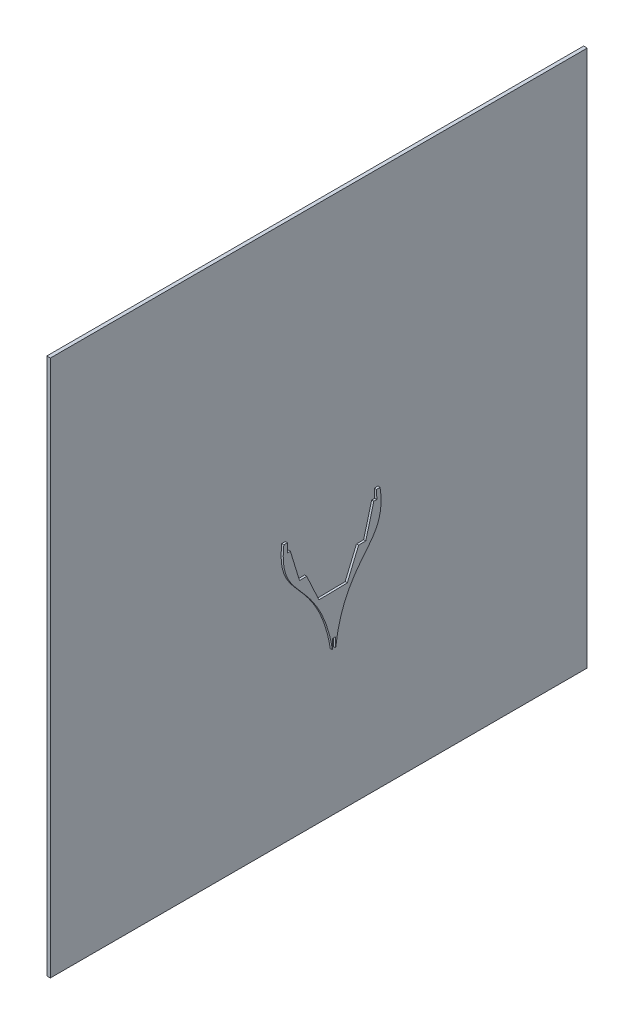
ISO-10303-21;
HEADER;
FILE_DESCRIPTION(('STEP AP214'),'2;1');
FILE_NAME('part.step','',(''),(''),'','','');
FILE_SCHEMA(('AUTOMOTIVE_DESIGN { 1 0 10303 214 1 1 1 1 }'));
ENDSEC;
DATA;
#1=APPLICATION_CONTEXT('core data for automotive mechanical design processes');
#2=APPLICATION_PROTOCOL_DEFINITION('international standard','automotive_design',2000,#1);
#3=PRODUCT_CONTEXT('',#1,'mechanical');
#4=PRODUCT('Part','Part','',(#3));
#5=PRODUCT_RELATED_PRODUCT_CATEGORY('part','',(#4));
#6=PRODUCT_DEFINITION_FORMATION('','',#4);
#7=PRODUCT_DEFINITION_CONTEXT('part definition',#1,'design');
#8=PRODUCT_DEFINITION('design','',#6,#7);
#9=PRODUCT_DEFINITION_SHAPE('','',#8);
#10=(LENGTH_UNIT() NAMED_UNIT(*) SI_UNIT(.MILLI.,.METRE.));
#11=(NAMED_UNIT(*) PLANE_ANGLE_UNIT() SI_UNIT($,.RADIAN.));
#12=(NAMED_UNIT(*) SI_UNIT($,.STERADIAN.) SOLID_ANGLE_UNIT());
#13=UNCERTAINTY_MEASURE_WITH_UNIT(LENGTH_MEASURE(1.E-05),#10,'distance_accuracy_value','');
#14=(GEOMETRIC_REPRESENTATION_CONTEXT(3) GLOBAL_UNCERTAINTY_ASSIGNED_CONTEXT((#13)) GLOBAL_UNIT_ASSIGNED_CONTEXT((#10,
#11,#12)) REPRESENTATION_CONTEXT('',''));
#15=CARTESIAN_POINT('',(0.,0.,0.));
#16=DIRECTION('',(0.,0.,1.));
#17=DIRECTION('',(1.,0.,0.));
#18=AXIS2_PLACEMENT_3D('',#15,#16,#17);
#19=CARTESIAN_POINT('',(6.,359.150420720607,141.004160791216));
#20=CARTESIAN_POINT('',(6.,184.373215516213,160.999534843018));
#21=CARTESIAN_POINT('',(6.,267.002875027698,12.1205447980956));
#22=CARTESIAN_POINT('',(6.,18.0649619587303,4.61229483232223));
#23=CARTESIAN_POINT('',(6.,0.,0.));
#24=B_SPLINE_CURVE_WITH_KNOTS('',4,(#19,#20,#21,#22,#23),.UNSPECIFIED.,.F.,.F.,(5,5),(0.,1.),.UNSPECIFIED.);
#25=DIRECTION('',(-1.,0.,0.));
#26=VECTOR('',#25,1.);
#27=SURFACE_OF_LINEAR_EXTRUSION('',#24,#26);
#28=CARTESIAN_POINT('',(0.,359.150420720607,141.004160791216));
#29=CARTESIAN_POINT('',(0.,184.373215516213,160.999534843018));
#30=CARTESIAN_POINT('',(0.,267.002875027698,12.1205447980956));
#31=CARTESIAN_POINT('',(0.,18.0649619587303,4.61229483232223));
#32=CARTESIAN_POINT('',(0.,0.,0.));
#33=B_SPLINE_CURVE_WITH_KNOTS('',4,(#28,#29,#30,#31,#32),.UNSPECIFIED.,.F.,.F.,(5,5),(0.,1.),.UNSPECIFIED.);
#34=CARTESIAN_POINT('',(0.,359.150420720607,141.004160791216));
#35=VERTEX_POINT('',#34);
#36=CARTESIAN_POINT('',(0.,37.3764689703785,5.17856558690667));
#37=VERTEX_POINT('',#36);
#38=EDGE_CURVE('E192',#35,#37,#33,.T.);
#39=ORIENTED_EDGE('',*,*,#38,.T.);
#40=DIRECTION('',(1.,0.,0.));
#41=VECTOR('',#40,1.);
#42=CARTESIAN_POINT('',(0.,37.3764689703785,5.17856558690667));
#43=LINE('',#42,#41);
#44=CARTESIAN_POINT('',(6.,37.3764689703785,5.17856558690667));
#45=VERTEX_POINT('',#44);
#46=EDGE_CURVE('E198',#37,#45,#43,.T.);
#47=ORIENTED_EDGE('',*,*,#46,.T.);
#48=CARTESIAN_POINT('',(6.,359.150420720607,141.004160791216));
#49=VERTEX_POINT('',#48);
#50=EDGE_CURVE('E232',#49,#45,#24,.T.);
#51=ORIENTED_EDGE('',*,*,#50,.F.);
#52=DIRECTION('',(-1.,0.,0.));
#53=VECTOR('',#52,1.);
#54=CARTESIAN_POINT('',(6.,359.150420720607,141.004160791216));
#55=LINE('',#54,#53);
#56=EDGE_CURVE('E188',#49,#35,#55,.T.);
#57=ORIENTED_EDGE('',*,*,#56,.T.);
#58=EDGE_LOOP('',(#39,#47,#51,#57));
#59=FACE_BOUND('',#58,.T.);
#60=ADVANCED_FACE('F45',(#59),#27,.F.);
#61=CARTESIAN_POINT('',(6.,0.,0.));
#62=CARTESIAN_POINT('',(6.,18.2201613043675,-3.95497613563854));
#63=CARTESIAN_POINT('',(6.,267.266681930229,-2.44205021752013));
#64=CARTESIAN_POINT('',(6.,190.083465853855,-154.216110794049));
#65=CARTESIAN_POINT('',(6.,364.021786678852,-127.903623433274));
#66=B_SPLINE_CURVE_WITH_KNOTS('',4,(#61,#62,#63,#64,#65),.UNSPECIFIED.,.F.,.F.,(5,5),(0.,1.),.UNSPECIFIED.);
#67=DIRECTION('',(-1.,0.,0.));
#68=VECTOR('',#67,1.);
#69=SURFACE_OF_LINEAR_EXTRUSION('',#66,#68);
#70=CARTESIAN_POINT('',(6.,37.5395073656805,-3.82143441309333));
#71=VERTEX_POINT('',#70);
#72=CARTESIAN_POINT('',(6.,364.021786678852,-127.903623433274));
#73=VERTEX_POINT('',#72);
#74=EDGE_CURVE('E128',#71,#73,#66,.T.);
#75=ORIENTED_EDGE('',*,*,#74,.F.);
#76=DIRECTION('',(1.,0.,0.));
#77=VECTOR('',#76,1.);
#78=CARTESIAN_POINT('',(0.,37.5395073656805,-3.82143441309333));
#79=LINE('',#78,#77);
#80=CARTESIAN_POINT('',(0.,37.5395073656805,-3.82143441309333));
#81=VERTEX_POINT('',#80);
#82=EDGE_CURVE('E322',#81,#71,#79,.T.);
#83=ORIENTED_EDGE('',*,*,#82,.F.);
#84=CARTESIAN_POINT('',(0.,0.,0.));
#85=CARTESIAN_POINT('',(0.,18.2201613043675,-3.95497613563854));
#86=CARTESIAN_POINT('',(0.,267.266681930229,-2.44205021752013));
#87=CARTESIAN_POINT('',(0.,190.083465853855,-154.216110794049));
#88=CARTESIAN_POINT('',(0.,364.021786678852,-127.903623433274));
#89=B_SPLINE_CURVE_WITH_KNOTS('',4,(#84,#85,#86,#87,#88),.UNSPECIFIED.,.F.,.F.,(5,5),(0.,1.),.UNSPECIFIED.);
#90=CARTESIAN_POINT('',(0.,364.021786678852,-127.903623433274));
#91=VERTEX_POINT('',#90);
#92=EDGE_CURVE('E197',#81,#91,#89,.T.);
#93=ORIENTED_EDGE('',*,*,#92,.T.);
#94=DIRECTION('',(-1.,0.,0.));
#95=VECTOR('',#94,1.);
#96=CARTESIAN_POINT('',(6.,364.021786678852,-127.903623433274));
#97=LINE('',#96,#95);
#98=EDGE_CURVE('E13',#73,#91,#97,.T.);
#99=ORIENTED_EDGE('',*,*,#98,.F.);
#100=EDGE_LOOP('',(#75,#83,#93,#99));
#101=FACE_BOUND('',#100,.T.);
#102=ADVANCED_FACE('F334',(#101),#69,.F.);
#103=CARTESIAN_POINT('',(6.,364.021786678852,-127.903623433274));
#104=DIRECTION('',(0.,-0.999835956927465,-0.0181124055536444));
#105=DIRECTION('',(0.,0.0181124055536444,-0.999835956927465));
#106=AXIS2_PLACEMENT_3D('',#103,#104,#105);
#107=PLANE('',#106);
#108=DIRECTION('',(0.,-0.0181124055536444,0.999835956927465));
#109=VECTOR('',#108,1.);
#110=CARTESIAN_POINT('',(0.,364.021786678852,-127.903623433274));
#111=LINE('',#110,#109);
#112=CARTESIAN_POINT('',(0.,363.840632906294,-117.903623433274));
#113=VERTEX_POINT('',#112);
#114=EDGE_CURVE('E205',#91,#113,#111,.T.);
#115=ORIENTED_EDGE('',*,*,#114,.T.);
#116=DIRECTION('',(-1.,0.,0.));
#117=VECTOR('',#116,1.);
#118=CARTESIAN_POINT('',(6.,363.840632906294,-117.903623433274));
#119=LINE('',#118,#117);
#120=CARTESIAN_POINT('',(6.,363.840632906294,-117.903623433274));
#121=VERTEX_POINT('',#120);
#122=EDGE_CURVE('E53',#121,#113,#119,.T.);
#123=ORIENTED_EDGE('',*,*,#122,.F.);
#124=DIRECTION('',(0.,-0.0181124055536444,0.999835956927465));
#125=VECTOR('',#124,1.);
#126=CARTESIAN_POINT('',(6.,364.021786678852,-127.903623433274));
#127=LINE('',#126,#125);
#128=EDGE_CURVE('E316',#73,#121,#127,.T.);
#129=ORIENTED_EDGE('',*,*,#128,.F.);
#130=ORIENTED_EDGE('',*,*,#98,.T.);
#131=EDGE_LOOP('',(#115,#123,#129,#130));
#132=FACE_BOUND('',#131,.T.);
#133=ADVANCED_FACE('F337',(#132),#107,.F.);
#134=CARTESIAN_POINT('',(6.,363.840632906294,-117.903623433274));
#135=DIRECTION('',(0.,0.0415686492906729,-0.999135650147741));
#136=DIRECTION('',(0.,0.999135650147741,0.0415686492906729));
#137=AXIS2_PLACEMENT_3D('',#134,#135,#136);
#138=PLANE('',#137);
#139=DIRECTION('',(0.,-0.999135650147741,-0.0415686492906729));
#140=VECTOR('',#139,1.);
#141=CARTESIAN_POINT('',(0.,363.840632906294,-117.903623433274));
#142=LINE('',#141,#140);
#143=CARTESIAN_POINT('',(0.,338.999069942575,-118.937146977868));
#144=VERTEX_POINT('',#143);
#145=EDGE_CURVE('E210',#113,#144,#142,.T.);
#146=ORIENTED_EDGE('',*,*,#145,.T.);
#147=DIRECTION('',(-1.,0.,0.));
#148=VECTOR('',#147,1.);
#149=CARTESIAN_POINT('',(6.,338.999069942575,-118.937146977868));
#150=LINE('',#149,#148);
#151=CARTESIAN_POINT('',(6.,338.999069942575,-118.937146977868));
#152=VERTEX_POINT('',#151);
#153=EDGE_CURVE('E257',#152,#144,#150,.T.);
#154=ORIENTED_EDGE('',*,*,#153,.F.);
#155=DIRECTION('',(0.,-0.999135650147741,-0.0415686492906729));
#156=VECTOR('',#155,1.);
#157=CARTESIAN_POINT('',(6.,363.840632906294,-117.903623433274));
#158=LINE('',#157,#156);
#159=EDGE_CURVE('E266',#121,#152,#158,.T.);
#160=ORIENTED_EDGE('',*,*,#159,.F.);
#161=ORIENTED_EDGE('',*,*,#122,.T.);
#162=EDGE_LOOP('',(#146,#154,#160,#161));
#163=FACE_BOUND('',#162,.T.);
#164=ADVANCED_FACE('F264',(#163),#138,.F.);
#165=CARTESIAN_POINT('',(6.,338.999069942575,-118.937146977868));
#166=DIRECTION('',(0.,-0.999835956927465,-0.0181124055536451));
#167=DIRECTION('',(0.,0.0181124055536451,-0.999835956927465));
#168=AXIS2_PLACEMENT_3D('',#165,#166,#167);
#169=PLANE('',#168);
#170=DIRECTION('',(0.,-0.0181124055536451,0.999835956927465));
#171=VECTOR('',#170,1.);
#172=CARTESIAN_POINT('',(0.,338.999069942575,-118.937146977868));
#173=LINE('',#172,#171);
#174=CARTESIAN_POINT('',(0.,338.84711977491,-110.549236225597));
#175=VERTEX_POINT('',#174);
#176=EDGE_CURVE('E212',#144,#175,#173,.T.);
#177=ORIENTED_EDGE('',*,*,#176,.T.);
#178=DIRECTION('',(-1.,0.,0.));
#179=VECTOR('',#178,1.);
#180=CARTESIAN_POINT('',(6.,338.84711977491,-110.549236225597));
#181=LINE('',#180,#179);
#182=CARTESIAN_POINT('',(6.,338.84711977491,-110.549236225597));
#183=VERTEX_POINT('',#182);
#184=EDGE_CURVE('E254',#183,#175,#181,.T.);
#185=ORIENTED_EDGE('',*,*,#184,.F.);
#186=DIRECTION('',(0.,-0.0181124055536451,0.999835956927465));
#187=VECTOR('',#186,1.);
#188=CARTESIAN_POINT('',(6.,338.999069942575,-118.937146977868));
#189=LINE('',#188,#187);
#190=EDGE_CURVE('E287',#152,#183,#189,.T.);
#191=ORIENTED_EDGE('',*,*,#190,.F.);
#192=ORIENTED_EDGE('',*,*,#153,.T.);
#193=EDGE_LOOP('',(#177,#185,#191,#192));
#194=FACE_BOUND('',#193,.T.);
#195=ADVANCED_FACE('F278',(#194),#169,.F.);
#196=CARTESIAN_POINT('',(6.,338.84711977491,-110.549236225597));
#197=DIRECTION('',(0.,-0.257490175426916,-0.966280916482684));
#198=DIRECTION('',(0.,0.966280916482684,-0.257490175426916));
#199=AXIS2_PLACEMENT_3D('',#196,#197,#198);
#200=PLANE('',#199);
#201=DIRECTION('',(0.,-0.966280916482684,0.257490175426916));
#202=VECTOR('',#201,1.);
#203=CARTESIAN_POINT('',(0.,338.84711977491,-110.549236225597));
#204=LINE('',#203,#202);
#205=CARTESIAN_POINT('',(0.,254.215348918144,-87.9969440785862));
#206=VERTEX_POINT('',#205);
#207=EDGE_CURVE('E214',#175,#206,#204,.T.);
#208=ORIENTED_EDGE('',*,*,#207,.T.);
#209=DIRECTION('',(-1.,0.,0.));
#210=VECTOR('',#209,1.);
#211=CARTESIAN_POINT('',(6.,254.215348918144,-87.9969440785862));
#212=LINE('',#211,#210);
#213=CARTESIAN_POINT('',(6.,254.215348918144,-87.9969440785862));
#214=VERTEX_POINT('',#213);
#215=EDGE_CURVE('E251',#214,#206,#212,.T.);
#216=ORIENTED_EDGE('',*,*,#215,.F.);
#217=DIRECTION('',(0.,-0.966280916482684,0.257490175426916));
#218=VECTOR('',#217,1.);
#219=CARTESIAN_POINT('',(6.,338.84711977491,-110.549236225597));
#220=LINE('',#219,#218);
#221=EDGE_CURVE('E284',#183,#214,#220,.T.);
#222=ORIENTED_EDGE('',*,*,#221,.F.);
#223=ORIENTED_EDGE('',*,*,#184,.T.);
#224=EDGE_LOOP('',(#208,#216,#222,#223));
#225=FACE_BOUND('',#224,.T.);
#226=ADVANCED_FACE('F282',(#225),#200,.F.);
#227=CARTESIAN_POINT('',(6.,254.215348918144,-87.9969440785862));
#228=DIRECTION('',(0.,-0.999835956927465,-0.0181124055536441));
#229=DIRECTION('',(0.,0.0181124055536441,-0.999835956927465));
#230=AXIS2_PLACEMENT_3D('',#227,#228,#229);
#231=PLANE('',#230);
#232=DIRECTION('',(0.,-0.0181124055536441,0.999835956927465));
#233=VECTOR('',#232,1.);
#234=CARTESIAN_POINT('',(0.,254.215348918144,-87.9969440785862));
#235=LINE('',#234,#233);
#236=CARTESIAN_POINT('',(0.,253.853344168558,-68.0136589129124));
#237=VERTEX_POINT('',#236);
#238=EDGE_CURVE('E216',#206,#237,#235,.T.);
#239=ORIENTED_EDGE('',*,*,#238,.T.);
#240=DIRECTION('',(-1.,0.,0.));
#241=VECTOR('',#240,1.);
#242=CARTESIAN_POINT('',(6.,253.853344168558,-68.0136589129124));
#243=LINE('',#242,#241);
#244=CARTESIAN_POINT('',(6.,253.853344168558,-68.0136589129124));
#245=VERTEX_POINT('',#244);
#246=EDGE_CURVE('E248',#245,#237,#243,.T.);
#247=ORIENTED_EDGE('',*,*,#246,.F.);
#248=DIRECTION('',(0.,-0.0181124055536441,0.999835956927465));
#249=VECTOR('',#248,1.);
#250=CARTESIAN_POINT('',(6.,254.215348918144,-87.9969440785862));
#251=LINE('',#250,#249);
#252=EDGE_CURVE('E286',#214,#245,#251,.T.);
#253=ORIENTED_EDGE('',*,*,#252,.F.);
#254=ORIENTED_EDGE('',*,*,#215,.T.);
#255=EDGE_LOOP('',(#239,#247,#253,#254));
#256=FACE_BOUND('',#255,.T.);
#257=ADVANCED_FACE('F347',(#256),#231,.F.);
#258=CARTESIAN_POINT('',(6.,253.853344168558,-68.0136589129124));
#259=DIRECTION('',(0.,-0.387005592603091,-0.922077367303813));
#260=DIRECTION('',(0.,0.922077367303813,-0.387005592603091));
#261=AXIS2_PLACEMENT_3D('',#258,#259,#260);
#262=PLANE('',#261);
#263=DIRECTION('',(0.,-0.922077367303813,0.387005592603091));
#264=VECTOR('',#263,1.);
#265=CARTESIAN_POINT('',(0.,253.853344168558,-68.0136589129124));
#266=LINE('',#265,#264);
#267=CARTESIAN_POINT('',(0.,178.517529169625,-36.3944230855001));
#268=VERTEX_POINT('',#267);
#269=EDGE_CURVE('E218',#237,#268,#266,.T.);
#270=ORIENTED_EDGE('',*,*,#269,.T.);
#271=DIRECTION('',(-1.,0.,0.));
#272=VECTOR('',#271,1.);
#273=CARTESIAN_POINT('',(6.,178.517529169625,-36.3944230855001));
#274=LINE('',#273,#272);
#275=CARTESIAN_POINT('',(6.,178.517529169625,-36.3944230855001));
#276=VERTEX_POINT('',#275);
#277=EDGE_CURVE('E245',#276,#268,#274,.T.);
#278=ORIENTED_EDGE('',*,*,#277,.F.);
#279=DIRECTION('',(0.,-0.922077367303813,0.387005592603091));
#280=VECTOR('',#279,1.);
#281=CARTESIAN_POINT('',(6.,253.853344168558,-68.0136589129124));
#282=LINE('',#281,#280);
#283=EDGE_CURVE('E289',#245,#276,#282,.T.);
#284=ORIENTED_EDGE('',*,*,#283,.F.);
#285=ORIENTED_EDGE('',*,*,#246,.T.);
#286=EDGE_LOOP('',(#270,#278,#284,#285));
#287=FACE_BOUND('',#286,.T.);
#288=ADVANCED_FACE('F350',(#287),#262,.F.);
#289=CARTESIAN_POINT('',(6.,178.517529169625,-36.3944230855001));
#290=DIRECTION('',(0.,-0.999835956927465,-0.018112405553643));
#291=DIRECTION('',(0.,0.018112405553643,-0.999835956927466));
#292=AXIS2_PLACEMENT_3D('',#289,#290,#291);
#293=PLANE('',#292);
#294=DIRECTION('',(0.,-0.018112405553643,0.999835956927465));
#295=VECTOR('',#294,1.);
#296=CARTESIAN_POINT('',(0.,178.517529169625,-36.3944230855001));
#297=LINE('',#296,#295);
#298=CARTESIAN_POINT('',(0.,177.082235691196,42.8362469780233));
#299=VERTEX_POINT('',#298);
#300=EDGE_CURVE('E220',#268,#299,#297,.T.);
#301=ORIENTED_EDGE('',*,*,#300,.T.);
#302=DIRECTION('',(-1.,0.,0.));
#303=VECTOR('',#302,1.);
#304=CARTESIAN_POINT('',(6.,177.082235691196,42.8362469780233));
#305=LINE('',#304,#303);
#306=CARTESIAN_POINT('',(6.,177.082235691196,42.8362469780233));
#307=VERTEX_POINT('',#306);
#308=EDGE_CURVE('E242',#307,#299,#305,.T.);
#309=ORIENTED_EDGE('',*,*,#308,.F.);
#310=DIRECTION('',(0.,-0.018112405553643,0.999835956927465));
#311=VECTOR('',#310,1.);
#312=CARTESIAN_POINT('',(6.,178.517529169625,-36.3944230855001));
#313=LINE('',#312,#311);
#314=EDGE_CURVE('E295',#276,#307,#313,.T.);
#315=ORIENTED_EDGE('',*,*,#314,.F.);
#316=ORIENTED_EDGE('',*,*,#277,.T.);
#317=EDGE_LOOP('',(#301,#309,#315,#316));
#318=FACE_BOUND('',#317,.T.);
#319=ADVANCED_FACE('F354',(#318),#293,.F.);
#320=CARTESIAN_POINT('',(6.,251.223408520333,77.1633148309999));
#321=DIRECTION('',(0.,-0.420148270163142,0.907455470576336));
#322=DIRECTION('',(0.,-0.907455470576336,-0.420148270163142));
#323=AXIS2_PLACEMENT_3D('',#320,#321,#322);
#324=PLANE('',#323);
#325=DIRECTION('',(0.,0.907455470576336,0.420148270163142));
#326=VECTOR('',#325,1.);
#327=CARTESIAN_POINT('',(0.,251.223408520333,77.1633148309999));
#328=LINE('',#327,#326);
#329=CARTESIAN_POINT('',(0.,251.223408520333,77.1633148309999));
#330=VERTEX_POINT('',#329);
#331=EDGE_CURVE('E222',#299,#330,#328,.T.);
#332=ORIENTED_EDGE('',*,*,#331,.T.);
#333=DIRECTION('',(-1.,0.,0.));
#334=VECTOR('',#333,1.);
#335=CARTESIAN_POINT('',(6.,251.223408520333,77.1633148309999));
#336=LINE('',#335,#334);
#337=CARTESIAN_POINT('',(6.,251.223408520333,77.1633148309999));
#338=VERTEX_POINT('',#337);
#339=EDGE_CURVE('E239',#338,#330,#336,.T.);
#340=ORIENTED_EDGE('',*,*,#339,.F.);
#341=DIRECTION('',(0.,0.907455470576336,0.420148270163142));
#342=VECTOR('',#341,1.);
#343=CARTESIAN_POINT('',(6.,251.223408520333,77.1633148309999));
#344=LINE('',#343,#342);
#345=EDGE_CURVE('E297',#307,#338,#344,.T.);
#346=ORIENTED_EDGE('',*,*,#345,.F.);
#347=ORIENTED_EDGE('',*,*,#308,.T.);
#348=EDGE_LOOP('',(#332,#340,#346,#347));
#349=FACE_BOUND('',#348,.T.);
#350=ADVANCED_FACE('F358',(#349),#324,.F.);
#351=CARTESIAN_POINT('',(6.,250.861403770747,97.1465999966737));
#352=DIRECTION('',(0.,-0.999835956927465,-0.0181124055536413));
#353=DIRECTION('',(0.,0.0181124055536413,-0.999835956927466));
#354=AXIS2_PLACEMENT_3D('',#351,#352,#353);
#355=PLANE('',#354);
#356=DIRECTION('',(0.,-0.0181124055536413,0.999835956927465));
#357=VECTOR('',#356,1.);
#358=CARTESIAN_POINT('',(0.,250.861403770747,97.1465999966737));
#359=LINE('',#358,#357);
#360=CARTESIAN_POINT('',(0.,250.861403770747,97.1465999966737));
#361=VERTEX_POINT('',#360);
#362=EDGE_CURVE('E224',#330,#361,#359,.T.);
#363=ORIENTED_EDGE('',*,*,#362,.T.);
#364=DIRECTION('',(-1.,0.,0.));
#365=VECTOR('',#364,1.);
#366=CARTESIAN_POINT('',(6.,250.861403770747,97.1465999966737));
#367=LINE('',#366,#365);
#368=CARTESIAN_POINT('',(6.,250.861403770747,97.1465999966737));
#369=VERTEX_POINT('',#368);
#370=EDGE_CURVE('E236',#369,#361,#367,.T.);
#371=ORIENTED_EDGE('',*,*,#370,.F.);
#372=DIRECTION('',(0.,-0.0181124055536413,0.999835956927465));
#373=VECTOR('',#372,1.);
#374=CARTESIAN_POINT('',(6.,250.861403770747,97.1465999966737));
#375=LINE('',#374,#373);
#376=EDGE_CURVE('E299',#338,#369,#375,.T.);
#377=ORIENTED_EDGE('',*,*,#376,.F.);
#378=ORIENTED_EDGE('',*,*,#339,.T.);
#379=EDGE_LOOP('',(#363,#371,#377,#378));
#380=FACE_BOUND('',#379,.T.);
#381=ADVANCED_FACE('F305',(#380),#355,.F.);
#382=CARTESIAN_POINT('',(6.,334.620827651855,122.749362162914));
#383=DIRECTION('',(0.,-0.29231883298712,0.956320918876633));
#384=DIRECTION('',(0.,-0.956320918876633,-0.29231883298712));
#385=AXIS2_PLACEMENT_3D('',#382,#383,#384);
#386=PLANE('',#385);
#387=DIRECTION('',(0.,0.956320918876633,0.29231883298712));
#388=VECTOR('',#387,1.);
#389=CARTESIAN_POINT('',(0.,334.620827651855,122.749362162914));
#390=LINE('',#389,#388);
#391=CARTESIAN_POINT('',(0.,334.620827651855,122.749362162914));
#392=VERTEX_POINT('',#391);
#393=EDGE_CURVE('E226',#361,#392,#390,.T.);
#394=ORIENTED_EDGE('',*,*,#393,.T.);
#395=DIRECTION('',(-1.,0.,0.));
#396=VECTOR('',#395,1.);
#397=CARTESIAN_POINT('',(6.,334.620827651855,122.749362162914));
#398=LINE('',#397,#396);
#399=CARTESIAN_POINT('',(6.,334.620827651855,122.749362162914));
#400=VERTEX_POINT('',#399);
#401=EDGE_CURVE('E183',#400,#392,#398,.T.);
#402=ORIENTED_EDGE('',*,*,#401,.F.);
#403=DIRECTION('',(0.,0.956320918876633,0.29231883298712));
#404=VECTOR('',#403,1.);
#405=CARTESIAN_POINT('',(6.,334.620827651855,122.749362162914));
#406=LINE('',#405,#404);
#407=EDGE_CURVE('E171',#369,#400,#406,.T.);
#408=ORIENTED_EDGE('',*,*,#407,.F.);
#409=ORIENTED_EDGE('',*,*,#370,.T.);
#410=EDGE_LOOP('',(#394,#402,#408,#409));
#411=FACE_BOUND('',#410,.T.);
#412=ADVANCED_FACE('F309',(#411),#386,.F.);
#413=CARTESIAN_POINT('',(6.,334.46887748419,131.137272915185));
#414=DIRECTION('',(0.,-0.999835956927465,-0.0181124055536384));
#415=DIRECTION('',(0.,0.0181124055536384,-0.999835956927465));
#416=AXIS2_PLACEMENT_3D('',#413,#414,#415);
#417=PLANE('',#416);
#418=DIRECTION('',(0.,-0.0181124055536384,0.999835956927466));
#419=VECTOR('',#418,1.);
#420=CARTESIAN_POINT('',(0.,334.46887748419,131.137272915185));
#421=LINE('',#420,#419);
#422=CARTESIAN_POINT('',(0.,334.46887748419,131.137272915185));
#423=VERTEX_POINT('',#422);
#424=EDGE_CURVE('E180',#392,#423,#421,.T.);
#425=ORIENTED_EDGE('',*,*,#424,.T.);
#426=DIRECTION('',(-1.,0.,0.));
#427=VECTOR('',#426,1.);
#428=CARTESIAN_POINT('',(6.,334.46887748419,131.137272915185));
#429=LINE('',#428,#427);
#430=CARTESIAN_POINT('',(6.,334.46887748419,131.137272915185));
#431=VERTEX_POINT('',#430);
#432=EDGE_CURVE('E177',#431,#423,#429,.T.);
#433=ORIENTED_EDGE('',*,*,#432,.F.);
#434=DIRECTION('',(0.,-0.0181124055536384,0.999835956927466));
#435=VECTOR('',#434,1.);
#436=CARTESIAN_POINT('',(6.,334.46887748419,131.137272915185));
#437=LINE('',#436,#435);
#438=EDGE_CURVE('E163',#400,#431,#437,.T.);
#439=ORIENTED_EDGE('',*,*,#438,.F.);
#440=ORIENTED_EDGE('',*,*,#401,.T.);
#441=EDGE_LOOP('',(#425,#433,#439,#440));
#442=FACE_BOUND('',#441,.T.);
#443=ADVANCED_FACE('F178',(#442),#417,.F.);
#444=CARTESIAN_POINT('',(6.,359.331574493165,131.004160791216));
#445=DIRECTION('',(0.,0.00535381242792315,0.999985668243544));
#446=DIRECTION('',(0.,-0.999985668243544,0.00535381242792315));
#447=AXIS2_PLACEMENT_3D('',#444,#445,#446);
#448=PLANE('',#447);
#449=DIRECTION('',(0.,0.999985668243544,-0.00535381242792315));
#450=VECTOR('',#449,1.);
#451=CARTESIAN_POINT('',(0.,359.331574493165,131.004160791216));
#452=LINE('',#451,#450);
#453=CARTESIAN_POINT('',(0.,359.331574493165,131.004160791216));
#454=VERTEX_POINT('',#453);
#455=EDGE_CURVE('E229',#423,#454,#452,.T.);
#456=ORIENTED_EDGE('',*,*,#455,.T.);
#457=DIRECTION('',(-1.,0.,0.));
#458=VECTOR('',#457,1.);
#459=CARTESIAN_POINT('',(6.,359.331574493165,131.004160791216));
#460=LINE('',#459,#458);
#461=CARTESIAN_POINT('',(6.,359.331574493165,131.004160791216));
#462=VERTEX_POINT('',#461);
#463=EDGE_CURVE('E184',#462,#454,#460,.T.);
#464=ORIENTED_EDGE('',*,*,#463,.F.);
#465=DIRECTION('',(0.,0.999985668243544,-0.00535381242792315));
#466=VECTOR('',#465,1.);
#467=CARTESIAN_POINT('',(6.,359.331574493165,131.004160791216));
#468=LINE('',#467,#466);
#469=EDGE_CURVE('E168',#431,#462,#468,.T.);
#470=ORIENTED_EDGE('',*,*,#469,.F.);
#471=ORIENTED_EDGE('',*,*,#432,.T.);
#472=EDGE_LOOP('',(#456,#464,#470,#471));
#473=FACE_BOUND('',#472,.T.);
#474=ADVANCED_FACE('F186',(#473),#448,.F.);
#475=CARTESIAN_POINT('',(6.,359.150420720607,141.004160791216));
#476=DIRECTION('',(0.,-0.999835956927465,-0.0181124055536447));
#477=DIRECTION('',(0.,0.0181124055536447,-0.999835956927465));
#478=AXIS2_PLACEMENT_3D('',#475,#476,#477);
#479=PLANE('',#478);
#480=DIRECTION('',(0.,-0.0181124055536447,0.999835956927465));
#481=VECTOR('',#480,1.);
#482=CARTESIAN_POINT('',(0.,359.150420720607,141.004160791216));
#483=LINE('',#482,#481);
#484=EDGE_CURVE('E120',#454,#35,#483,.T.);
#485=ORIENTED_EDGE('',*,*,#484,.T.);
#486=ORIENTED_EDGE('',*,*,#56,.F.);
#487=DIRECTION('',(0.,-0.0181124055536447,0.999835956927465));
#488=VECTOR('',#487,1.);
#489=CARTESIAN_POINT('',(6.,359.150420720607,141.004160791216));
#490=LINE('',#489,#488);
#491=EDGE_CURVE('E69',#462,#49,#490,.T.);
#492=ORIENTED_EDGE('',*,*,#491,.F.);
#493=ORIENTED_EDGE('',*,*,#463,.T.);
#494=EDGE_LOOP('',(#485,#486,#492,#493));
#495=FACE_BOUND('',#494,.T.);
#496=ADVANCED_FACE('F311',(#495),#479,.F.);
#497=CARTESIAN_POINT('',(6.,173.182523799161,54.760921767572));
#498=DIRECTION('',(1.,0.,0.));
#499=DIRECTION('',(0.,0.,-1.));
#500=AXIS2_PLACEMENT_3D('',#497,#498,#499);
#501=PLANE('',#500);
#502=DIRECTION('',(0.,-0.999835956927465,-0.0181124055536429));
#503=VECTOR('',#502,1.);
#504=CARTESIAN_POINT('',(6.,37.3764689703785,5.17856558690667));
#505=LINE('',#504,#503);
#506=CARTESIAN_POINT('',(6.,64.3764689703785,5.66768077281295));
#507=VERTEX_POINT('',#506);
#508=EDGE_CURVE('E510',#507,#45,#505,.T.);
#509=ORIENTED_EDGE('',*,*,#508,.F.);
#510=DIRECTION('',(0.,-0.0181124055536438,0.999835956927465));
#511=VECTOR('',#510,1.);
#512=CARTESIAN_POINT('',(6.,64.3764689703785,5.66768077281295));
#513=LINE('',#512,#511);
#514=CARTESIAN_POINT('',(6.,64.5395073656806,-3.33231922718705));
#515=VERTEX_POINT('',#514);
#516=EDGE_CURVE('E519',#515,#507,#513,.T.);
#517=ORIENTED_EDGE('',*,*,#516,.F.);
#518=DIRECTION('',(0.,0.999835956927465,0.0181124055536428));
#519=VECTOR('',#518,1.);
#520=CARTESIAN_POINT('',(6.,64.5395073656806,-3.33231922718705));
#521=LINE('',#520,#519);
#522=EDGE_CURVE('E523',#71,#515,#521,.T.);
#523=ORIENTED_EDGE('',*,*,#522,.F.);
#524=ORIENTED_EDGE('',*,*,#74,.T.);
#525=ORIENTED_EDGE('',*,*,#128,.T.);
#526=ORIENTED_EDGE('',*,*,#159,.T.);
#527=ORIENTED_EDGE('',*,*,#190,.T.);
#528=ORIENTED_EDGE('',*,*,#221,.T.);
#529=ORIENTED_EDGE('',*,*,#252,.T.);
#530=ORIENTED_EDGE('',*,*,#283,.T.);
#531=ORIENTED_EDGE('',*,*,#314,.T.);
#532=ORIENTED_EDGE('',*,*,#345,.T.);
#533=ORIENTED_EDGE('',*,*,#376,.T.);
#534=ORIENTED_EDGE('',*,*,#407,.T.);
#535=ORIENTED_EDGE('',*,*,#438,.T.);
#536=ORIENTED_EDGE('',*,*,#469,.T.);
#537=ORIENTED_EDGE('',*,*,#491,.T.);
#538=ORIENTED_EDGE('',*,*,#50,.T.);
#539=EDGE_LOOP('',(#509,#517,#523,#524,#525,#526,#527,#528,#529,#530,#531,#532,#533,#534,#535,
#536,#537,#538));
#540=FACE_BOUND('',#539,.T.);
#541=ADVANCED_FACE('F166',(#540),#501,.T.);
#542=CARTESIAN_POINT('',(0.,173.182523799161,54.760921767572));
#543=DIRECTION('',(1.,0.,0.));
#544=DIRECTION('',(0.,0.,-1.));
#545=AXIS2_PLACEMENT_3D('',#542,#543,#544);
#546=PLANE('',#545);
#547=DIRECTION('',(0.,-0.0181124055536438,0.999835956927465));
#548=VECTOR('',#547,1.);
#549=CARTESIAN_POINT('',(0.,64.3764689703785,5.66768077281295));
#550=LINE('',#549,#548);
#551=CARTESIAN_POINT('',(0.,64.5395073656806,-3.33231922718704));
#552=VERTEX_POINT('',#551);
#553=CARTESIAN_POINT('',(0.,64.3764689703785,5.66768077281295));
#554=VERTEX_POINT('',#553);
#555=EDGE_CURVE('E60',#552,#554,#550,.T.);
#556=ORIENTED_EDGE('',*,*,#555,.T.);
#557=DIRECTION('',(0.,-0.999835956927465,-0.0181124055536429));
#558=VECTOR('',#557,1.);
#559=CARTESIAN_POINT('',(0.,37.3764689703785,5.17856558690667));
#560=LINE('',#559,#558);
#561=EDGE_CURVE('E532',#554,#37,#560,.T.);
#562=ORIENTED_EDGE('',*,*,#561,.T.);
#563=ORIENTED_EDGE('',*,*,#38,.F.);
#564=ORIENTED_EDGE('',*,*,#484,.F.);
#565=ORIENTED_EDGE('',*,*,#455,.F.);
#566=ORIENTED_EDGE('',*,*,#424,.F.);
#567=ORIENTED_EDGE('',*,*,#393,.F.);
#568=ORIENTED_EDGE('',*,*,#362,.F.);
#569=ORIENTED_EDGE('',*,*,#331,.F.);
#570=ORIENTED_EDGE('',*,*,#300,.F.);
#571=ORIENTED_EDGE('',*,*,#269,.F.);
#572=ORIENTED_EDGE('',*,*,#238,.F.);
#573=ORIENTED_EDGE('',*,*,#207,.F.);
#574=ORIENTED_EDGE('',*,*,#176,.F.);
#575=ORIENTED_EDGE('',*,*,#145,.F.);
#576=ORIENTED_EDGE('',*,*,#114,.F.);
#577=ORIENTED_EDGE('',*,*,#92,.F.);
#578=DIRECTION('',(0.,0.999835956927465,0.0181124055536428));
#579=VECTOR('',#578,1.);
#580=CARTESIAN_POINT('',(0.,64.5395073656806,-3.33231922718705));
#581=LINE('',#580,#579);
#582=EDGE_CURVE('E518',#81,#552,#581,.T.);
#583=ORIENTED_EDGE('',*,*,#582,.T.);
#584=EDGE_LOOP('',(#556,#562,#563,#564,#565,#566,#567,#568,#569,#570,#571,#572,#573,#574,#575,
#576,#577,#583));
#585=FACE_BOUND('',#584,.T.);
#586=ADVANCED_FACE('F272',(#585),#546,.F.);
#587=CARTESIAN_POINT('',(0.,37.3764689703785,5.17856558690667));
#588=DIRECTION('',(0.,-0.0181124055536429,0.999835956927465));
#589=DIRECTION('',(0.,-0.999835956927466,-0.0181124055536429));
#590=AXIS2_PLACEMENT_3D('',#587,#588,#589);
#591=PLANE('',#590);
#592=ORIENTED_EDGE('',*,*,#508,.T.);
#593=ORIENTED_EDGE('',*,*,#46,.F.);
#594=ORIENTED_EDGE('',*,*,#561,.F.);
#595=DIRECTION('',(1.,0.,0.));
#596=VECTOR('',#595,1.);
#597=CARTESIAN_POINT('',(0.,64.3764689703785,5.66768077281295));
#598=LINE('',#597,#596);
#599=EDGE_CURVE('E514',#554,#507,#598,.T.);
#600=ORIENTED_EDGE('',*,*,#599,.T.);
#601=EDGE_LOOP('',(#592,#593,#594,#600));
#602=FACE_BOUND('',#601,.T.);
#603=ADVANCED_FACE('F375',(#602),#591,.F.);
#604=CARTESIAN_POINT('',(0.,64.3764689703785,5.66768077281295));
#605=DIRECTION('',(0.,0.999835956927465,0.0181124055536438));
#606=DIRECTION('',(0.,-0.0181124055536438,0.999835956927466));
#607=AXIS2_PLACEMENT_3D('',#604,#605,#606);
#608=PLANE('',#607);
#609=ORIENTED_EDGE('',*,*,#516,.T.);
#610=ORIENTED_EDGE('',*,*,#599,.F.);
#611=ORIENTED_EDGE('',*,*,#555,.F.);
#612=DIRECTION('',(1.,0.,0.));
#613=VECTOR('',#612,1.);
#614=CARTESIAN_POINT('',(0.,64.5395073656806,-3.33231922718705));
#615=LINE('',#614,#613);
#616=EDGE_CURVE('E528',#552,#515,#615,.T.);
#617=ORIENTED_EDGE('',*,*,#616,.T.);
#618=EDGE_LOOP('',(#609,#610,#611,#617));
#619=FACE_BOUND('',#618,.T.);
#620=ADVANCED_FACE('F381',(#619),#608,.F.);
#621=CARTESIAN_POINT('',(0.,64.5395073656806,-3.33231922718705));
#622=DIRECTION('',(0.,0.0181124055536428,-0.999835956927465));
#623=DIRECTION('',(0.,0.999835956927466,0.0181124055536428));
#624=AXIS2_PLACEMENT_3D('',#621,#622,#623);
#625=PLANE('',#624);
#626=ORIENTED_EDGE('',*,*,#522,.T.);
#627=ORIENTED_EDGE('',*,*,#616,.F.);
#628=ORIENTED_EDGE('',*,*,#582,.F.);
#629=ORIENTED_EDGE('',*,*,#82,.T.);
#630=EDGE_LOOP('',(#626,#627,#628,#629));
#631=FACE_BOUND('',#630,.T.);
#632=ADVANCED_FACE('F378',(#631),#625,.F.);
#633=CLOSED_SHELL('',(#60,#102,#133,#164,#195,#226,#257,#288,#319,#350,#381,#412,#443,#474,#496,
#541,#586,#603,#620,#632));
#634=MANIFOLD_SOLID_BREP('B2',#633);
#635=CARTESIAN_POINT('',(-10.,0.,0.));
#636=DIRECTION('',(-1.,0.,0.));
#637=DIRECTION('',(0.,0.,1.));
#638=AXIS2_PLACEMENT_3D('',#635,#636,#637);
#639=PLANE('',#638);
#640=DIRECTION('',(0.,0.,-1.));
#641=VECTOR('',#640,1.);
#642=CARTESIAN_POINT('',(-10.,-378.710653275796,777.274991403029));
#643=LINE('',#642,#641);
#644=CARTESIAN_POINT('',(-10.,-378.710653275796,777.274991403029));
#645=VERTEX_POINT('',#644);
#646=CARTESIAN_POINT('',(-10.,-378.710653275796,-722.725008596971));
#647=VERTEX_POINT('',#646);
#648=EDGE_CURVE('E563',#645,#647,#643,.T.);
#649=ORIENTED_EDGE('',*,*,#648,.T.);
#650=DIRECTION('',(0.,-1.,0.));
#651=VECTOR('',#650,1.);
#652=CARTESIAN_POINT('',(-10.,1121.2893467242,-722.725008596971));
#653=LINE('',#652,#651);
#654=CARTESIAN_POINT('',(-10.,1121.2893467242,-722.725008596971));
#655=VERTEX_POINT('',#654);
#656=EDGE_CURVE('E597',#655,#647,#653,.T.);
#657=ORIENTED_EDGE('',*,*,#656,.F.);
#658=DIRECTION('',(0.,0.,-1.));
#659=VECTOR('',#658,1.);
#660=CARTESIAN_POINT('',(-10.,1121.2893467242,777.274991403029));
#661=LINE('',#660,#659);
#662=CARTESIAN_POINT('',(-10.,1121.2893467242,777.274991403029));
#663=VERTEX_POINT('',#662);
#664=EDGE_CURVE('E594',#663,#655,#661,.T.);
#665=ORIENTED_EDGE('',*,*,#664,.F.);
#666=DIRECTION('',(0.,-1.,0.));
#667=VECTOR('',#666,1.);
#668=CARTESIAN_POINT('',(-10.,1121.2893467242,777.274991403029));
#669=LINE('',#668,#667);
#670=EDGE_CURVE('E591',#663,#645,#669,.T.);
#671=ORIENTED_EDGE('',*,*,#670,.T.);
#672=EDGE_LOOP('',(#649,#657,#665,#671));
#673=FACE_BOUND('',#672,.T.);
#674=ADVANCED_FACE('F554',(#673),#639,.F.);
#675=CARTESIAN_POINT('',(-20.,0.,0.));
#676=DIRECTION('',(-1.,0.,0.));
#677=DIRECTION('',(0.,0.,1.));
#678=AXIS2_PLACEMENT_3D('',#675,#676,#677);
#679=PLANE('',#678);
#680=DIRECTION('',(0.,0.,-1.));
#681=VECTOR('',#680,1.);
#682=CARTESIAN_POINT('',(-20.,-378.710653275796,777.274991403029));
#683=LINE('',#682,#681);
#684=CARTESIAN_POINT('',(-20.,-378.710653275796,777.274991403029));
#685=VERTEX_POINT('',#684);
#686=CARTESIAN_POINT('',(-20.,-378.710653275796,-722.725008596971));
#687=VERTEX_POINT('',#686);
#688=EDGE_CURVE('E43',#685,#687,#683,.T.);
#689=ORIENTED_EDGE('',*,*,#688,.F.);
#690=DIRECTION('',(0.,-1.,0.));
#691=VECTOR('',#690,1.);
#692=CARTESIAN_POINT('',(-20.,1121.2893467242,777.274991403029));
#693=LINE('',#692,#691);
#694=CARTESIAN_POINT('',(-20.,1121.2893467242,777.274991403029));
#695=VERTEX_POINT('',#694);
#696=EDGE_CURVE('E610',#695,#685,#693,.T.);
#697=ORIENTED_EDGE('',*,*,#696,.F.);
#698=DIRECTION('',(0.,0.,-1.));
#699=VECTOR('',#698,1.);
#700=CARTESIAN_POINT('',(-20.,1121.2893467242,777.274991403029));
#701=LINE('',#700,#699);
#702=CARTESIAN_POINT('',(-20.,1121.2893467242,-722.725008596971));
#703=VERTEX_POINT('',#702);
#704=EDGE_CURVE('E601',#695,#703,#701,.T.);
#705=ORIENTED_EDGE('',*,*,#704,.T.);
#706=DIRECTION('',(0.,-1.,0.));
#707=VECTOR('',#706,1.);
#708=CARTESIAN_POINT('',(-20.,1121.2893467242,-722.725008596971));
#709=LINE('',#708,#707);
#710=EDGE_CURVE('E572',#703,#687,#709,.T.);
#711=ORIENTED_EDGE('',*,*,#710,.T.);
#712=EDGE_LOOP('',(#689,#697,#705,#711));
#713=FACE_BOUND('',#712,.T.);
#714=ADVANCED_FACE('F650',(#713),#679,.T.);
#715=CARTESIAN_POINT('',(-20.,1121.2893467242,777.274991403029));
#716=DIRECTION('',(0.,0.,1.));
#717=DIRECTION('',(1.,0.,0.));
#718=AXIS2_PLACEMENT_3D('',#715,#716,#717);
#719=PLANE('',#718);
#720=ORIENTED_EDGE('',*,*,#670,.F.);
#721=DIRECTION('',(1.,0.,0.));
#722=VECTOR('',#721,1.);
#723=CARTESIAN_POINT('',(-20.,1121.2893467242,777.274991403029));
#724=LINE('',#723,#722);
#725=EDGE_CURVE('E606',#695,#663,#724,.T.);
#726=ORIENTED_EDGE('',*,*,#725,.F.);
#727=ORIENTED_EDGE('',*,*,#696,.T.);
#728=DIRECTION('',(1.,0.,0.));
#729=VECTOR('',#728,1.);
#730=CARTESIAN_POINT('',(-20.,-378.710653275796,777.274991403029));
#731=LINE('',#730,#729);
#732=EDGE_CURVE('E602',#685,#645,#731,.T.);
#733=ORIENTED_EDGE('',*,*,#732,.T.);
#734=EDGE_LOOP('',(#720,#726,#727,#733));
#735=FACE_BOUND('',#734,.T.);
#736=ADVANCED_FACE('F611',(#735),#719,.T.);
#737=CARTESIAN_POINT('',(-20.,-378.710653275796,777.274991403029));
#738=DIRECTION('',(0.,-1.,0.));
#739=DIRECTION('',(0.,0.,-1.));
#740=AXIS2_PLACEMENT_3D('',#737,#738,#739);
#741=PLANE('',#740);
#742=ORIENTED_EDGE('',*,*,#648,.F.);
#743=ORIENTED_EDGE('',*,*,#732,.F.);
#744=ORIENTED_EDGE('',*,*,#688,.T.);
#745=DIRECTION('',(1.,0.,0.));
#746=VECTOR('',#745,1.);
#747=CARTESIAN_POINT('',(-20.,-378.710653275796,-722.725008596971));
#748=LINE('',#747,#746);
#749=EDGE_CURVE('E622',#687,#647,#748,.T.);
#750=ORIENTED_EDGE('',*,*,#749,.T.);
#751=EDGE_LOOP('',(#742,#743,#744,#750));
#752=FACE_BOUND('',#751,.T.);
#753=ADVANCED_FACE('F652',(#752),#741,.T.);
#754=CARTESIAN_POINT('',(-20.,1121.2893467242,777.274991403029));
#755=DIRECTION('',(0.,-1.,0.));
#756=DIRECTION('',(0.,0.,-1.));
#757=AXIS2_PLACEMENT_3D('',#754,#755,#756);
#758=PLANE('',#757);
#759=ORIENTED_EDGE('',*,*,#664,.T.);
#760=DIRECTION('',(1.,0.,0.));
#761=VECTOR('',#760,1.);
#762=CARTESIAN_POINT('',(-20.,1121.2893467242,-722.725008596971));
#763=LINE('',#762,#761);
#764=EDGE_CURVE('E626',#703,#655,#763,.T.);
#765=ORIENTED_EDGE('',*,*,#764,.F.);
#766=ORIENTED_EDGE('',*,*,#704,.F.);
#767=ORIENTED_EDGE('',*,*,#725,.T.);
#768=EDGE_LOOP('',(#759,#765,#766,#767));
#769=FACE_BOUND('',#768,.T.);
#770=ADVANCED_FACE('F607',(#769),#758,.F.);
#771=CARTESIAN_POINT('',(-20.,1121.2893467242,-722.725008596971));
#772=DIRECTION('',(0.,0.,1.));
#773=DIRECTION('',(1.,0.,0.));
#774=AXIS2_PLACEMENT_3D('',#771,#772,#773);
#775=PLANE('',#774);
#776=ORIENTED_EDGE('',*,*,#656,.T.);
#777=ORIENTED_EDGE('',*,*,#749,.F.);
#778=ORIENTED_EDGE('',*,*,#710,.F.);
#779=ORIENTED_EDGE('',*,*,#764,.T.);
#780=EDGE_LOOP('',(#776,#777,#778,#779));
#781=FACE_BOUND('',#780,.T.);
#782=ADVANCED_FACE('F637',(#781),#775,.F.);
#783=CLOSED_SHELL('',(#674,#714,#736,#753,#770,#782));
#784=MANIFOLD_SOLID_BREP('B7_NOT_SHOWN',#783);
#785=ADVANCED_BREP_SHAPE_REPRESENTATION('',(#18,#634,#784),#14);
#786=SHAPE_DEFINITION_REPRESENTATION(#9,#785);
ENDSEC;
END-ISO-10303-21;
